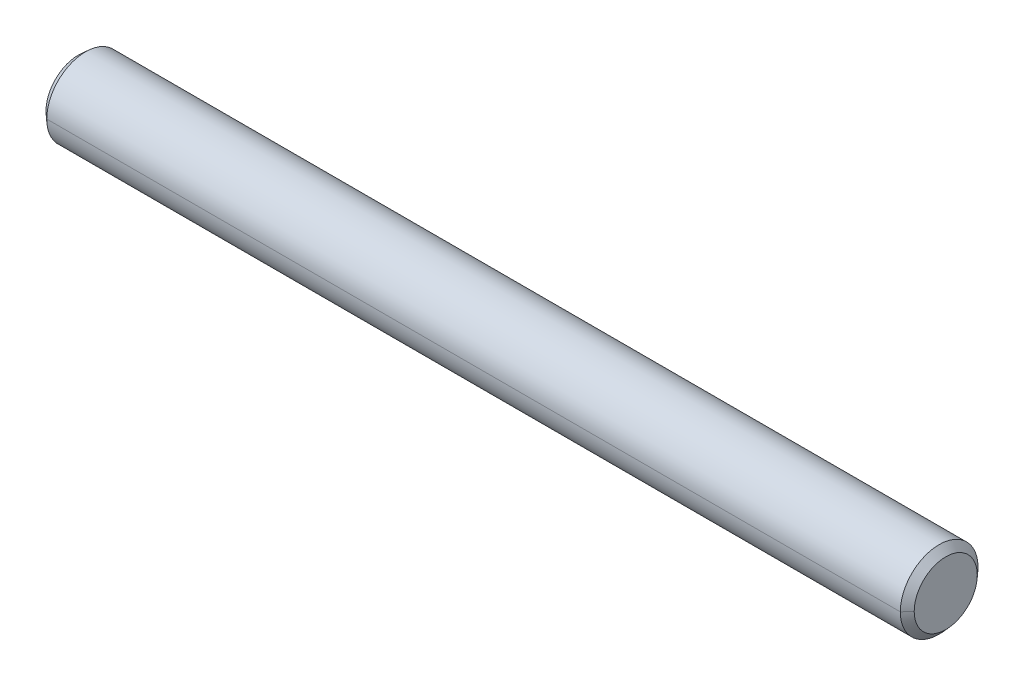
ISO-10303-21;
HEADER;
FILE_DESCRIPTION(('STEP AP214'),'2;1');
FILE_NAME('part.step','',(''),(''),'','','');
FILE_SCHEMA(('AUTOMOTIVE_DESIGN { 1 0 10303 214 1 1 1 1 }'));
ENDSEC;
DATA;
#1=APPLICATION_CONTEXT('core data for automotive mechanical design processes');
#2=APPLICATION_PROTOCOL_DEFINITION('international standard','automotive_design',2000,#1);
#3=PRODUCT_CONTEXT('',#1,'mechanical');
#4=PRODUCT('Part','Part','',(#3));
#5=PRODUCT_RELATED_PRODUCT_CATEGORY('part','',(#4));
#6=PRODUCT_DEFINITION_FORMATION('','',#4);
#7=PRODUCT_DEFINITION_CONTEXT('part definition',#1,'design');
#8=PRODUCT_DEFINITION('design','',#6,#7);
#9=PRODUCT_DEFINITION_SHAPE('','',#8);
#10=(LENGTH_UNIT() NAMED_UNIT(*) SI_UNIT(.MILLI.,.METRE.));
#11=(NAMED_UNIT(*) PLANE_ANGLE_UNIT() SI_UNIT($,.RADIAN.));
#12=(NAMED_UNIT(*) SI_UNIT($,.STERADIAN.) SOLID_ANGLE_UNIT());
#13=UNCERTAINTY_MEASURE_WITH_UNIT(LENGTH_MEASURE(1.E-05),#10,'distance_accuracy_value','');
#14=(GEOMETRIC_REPRESENTATION_CONTEXT(3) GLOBAL_UNCERTAINTY_ASSIGNED_CONTEXT((#13)) GLOBAL_UNIT_ASSIGNED_CONTEXT((#10,
#11,#12)) REPRESENTATION_CONTEXT('',''));
#15=CARTESIAN_POINT('',(0.,0.,0.));
#16=DIRECTION('',(0.,0.,1.));
#17=DIRECTION('',(1.,0.,0.));
#18=AXIS2_PLACEMENT_3D('',#15,#16,#17);
#19=CARTESIAN_POINT('',(16.75,0.,0.));
#20=DIRECTION('',(-1.,0.,0.));
#21=DIRECTION('',(0.,0.,1.));
#22=AXIS2_PLACEMENT_3D('',#19,#20,#21);
#23=CONICAL_SURFACE('',#22,1.21790442123338,0.837758040957279);
#24=CARTESIAN_POINT('',(16.75,0.,0.));
#25=DIRECTION('',(1.,0.,0.));
#26=DIRECTION('',(0.,0.,-1.));
#27=AXIS2_PLACEMENT_3D('',#24,#25,#26);
#28=CIRCLE('',#27,1.21790442123338);
#29=CARTESIAN_POINT('',(16.75,0.,-1.21790442123338));
#30=VERTEX_POINT('',#29);
#31=CARTESIAN_POINT('',(16.75,0.,1.21790442123338));
#32=VERTEX_POINT('',#31);
#33=EDGE_CURVE('E41',#30,#32,#28,.T.);
#34=ORIENTED_EDGE('',*,*,#33,.F.);
#35=DIRECTION('',(-0.669130606358858,0.,-0.743144825477394));
#36=VECTOR('',#35,1.);
#37=CARTESIAN_POINT('',(16.75,0.,-1.21790442123338));
#38=LINE('',#37,#36);
#39=CARTESIAN_POINT('',(16.496,0.,-1.5));
#40=VERTEX_POINT('',#39);
#41=EDGE_CURVE('E11',#30,#40,#38,.T.);
#42=ORIENTED_EDGE('',*,*,#41,.T.);
#43=CARTESIAN_POINT('',(16.496,0.,0.));
#44=DIRECTION('',(-1.,0.,0.));
#45=DIRECTION('',(0.,0.,-1.));
#46=AXIS2_PLACEMENT_3D('',#43,#44,#45);
#47=CIRCLE('',#46,1.5);
#48=CARTESIAN_POINT('',(16.496,0.,1.5));
#49=VERTEX_POINT('',#48);
#50=EDGE_CURVE('E86',#49,#40,#47,.T.);
#51=ORIENTED_EDGE('',*,*,#50,.F.);
#52=DIRECTION('',(-0.669130606358858,0.,0.743144825477394));
#53=VECTOR('',#52,1.);
#54=CARTESIAN_POINT('',(16.75,0.,1.21790442123338));
#55=LINE('',#54,#53);
#56=EDGE_CURVE('E84',#32,#49,#55,.T.);
#57=ORIENTED_EDGE('',*,*,#56,.F.);
#58=EDGE_LOOP('',(#34,#42,#51,#57));
#59=FACE_BOUND('',#58,.T.);
#60=ADVANCED_FACE('F16',(#59),#23,.T.);
#61=CARTESIAN_POINT('',(-16.4679044212334,0.,0.));
#62=DIRECTION('',(1.,0.,0.));
#63=DIRECTION('',(0.,0.,-1.));
#64=AXIS2_PLACEMENT_3D('',#61,#62,#63);
#65=CONICAL_SURFACE('',#64,1.5,0.733038285837623);
#66=CARTESIAN_POINT('',(-16.75,0.,0.));
#67=DIRECTION('',(-1.,0.,0.));
#68=DIRECTION('',(0.,0.,-1.));
#69=AXIS2_PLACEMENT_3D('',#66,#67,#68);
#70=CIRCLE('',#69,1.246);
#71=CARTESIAN_POINT('',(-16.75,0.,1.246));
#72=VERTEX_POINT('',#71);
#73=CARTESIAN_POINT('',(-16.75,0.,-1.246));
#74=VERTEX_POINT('',#73);
#75=EDGE_CURVE('E78',#72,#74,#70,.T.);
#76=ORIENTED_EDGE('',*,*,#75,.F.);
#77=DIRECTION('',(0.743144825477391,0.,0.669130606358863));
#78=VECTOR('',#77,1.);
#79=CARTESIAN_POINT('',(-16.4679044212334,0.,1.5));
#80=LINE('',#79,#78);
#81=CARTESIAN_POINT('',(-16.4679044212334,0.,1.5));
#82=VERTEX_POINT('',#81);
#83=EDGE_CURVE('E27',#72,#82,#80,.T.);
#84=ORIENTED_EDGE('',*,*,#83,.T.);
#85=CARTESIAN_POINT('',(-16.4679044212334,0.,0.));
#86=DIRECTION('',(1.,0.,0.));
#87=DIRECTION('',(0.,0.,-1.));
#88=AXIS2_PLACEMENT_3D('',#85,#86,#87);
#89=CIRCLE('',#88,1.5);
#90=CARTESIAN_POINT('',(-16.4679044212334,0.,-1.5));
#91=VERTEX_POINT('',#90);
#92=EDGE_CURVE('E117',#91,#82,#89,.T.);
#93=ORIENTED_EDGE('',*,*,#92,.F.);
#94=DIRECTION('',(0.743144825477391,0.,-0.669130606358863));
#95=VECTOR('',#94,1.);
#96=CARTESIAN_POINT('',(-16.4679044212334,0.,-1.5));
#97=LINE('',#96,#95);
#98=EDGE_CURVE('E91',#74,#91,#97,.T.);
#99=ORIENTED_EDGE('',*,*,#98,.F.);
#100=EDGE_LOOP('',(#76,#84,#93,#99));
#101=FACE_BOUND('',#100,.T.);
#102=ADVANCED_FACE('F18',(#101),#65,.T.);
#103=CARTESIAN_POINT('',(16.75,0.,0.));
#104=DIRECTION('',(-1.,0.,0.));
#105=DIRECTION('',(0.,0.,1.));
#106=AXIS2_PLACEMENT_3D('',#103,#104,#105);
#107=CYLINDRICAL_SURFACE('',#106,1.5);
#108=ORIENTED_EDGE('',*,*,#50,.T.);
#109=DIRECTION('',(-1.,0.,0.));
#110=VECTOR('',#109,1.);
#111=CARTESIAN_POINT('',(16.75,0.,-1.5));
#112=LINE('',#111,#110);
#113=EDGE_CURVE('E121',#40,#91,#112,.T.);
#114=ORIENTED_EDGE('',*,*,#113,.T.);
#115=ORIENTED_EDGE('',*,*,#92,.T.);
#116=DIRECTION('',(-1.,0.,0.));
#117=VECTOR('',#116,1.);
#118=CARTESIAN_POINT('',(16.75,0.,1.5));
#119=LINE('',#118,#117);
#120=EDGE_CURVE('E69',#49,#82,#119,.T.);
#121=ORIENTED_EDGE('',*,*,#120,.F.);
#122=EDGE_LOOP('',(#108,#114,#115,#121));
#123=FACE_BOUND('',#122,.T.);
#124=ADVANCED_FACE('F151',(#123),#107,.T.);
#125=CARTESIAN_POINT('',(16.75,0.,0.));
#126=DIRECTION('',(-1.,0.,0.));
#127=DIRECTION('',(0.,0.,1.));
#128=AXIS2_PLACEMENT_3D('',#125,#126,#127);
#129=CYLINDRICAL_SURFACE('',#128,1.5);
#130=ORIENTED_EDGE('',*,*,#113,.F.);
#131=CARTESIAN_POINT('',(16.496,0.,0.));
#132=DIRECTION('',(-1.,0.,0.));
#133=DIRECTION('',(0.,0.,-1.));
#134=AXIS2_PLACEMENT_3D('',#131,#132,#133);
#135=CIRCLE('',#134,1.5);
#136=EDGE_CURVE('E115',#40,#49,#135,.T.);
#137=ORIENTED_EDGE('',*,*,#136,.T.);
#138=ORIENTED_EDGE('',*,*,#120,.T.);
#139=CARTESIAN_POINT('',(-16.4679044212334,0.,0.));
#140=DIRECTION('',(1.,0.,0.));
#141=DIRECTION('',(0.,0.,-1.));
#142=AXIS2_PLACEMENT_3D('',#139,#140,#141);
#143=CIRCLE('',#142,1.5);
#144=EDGE_CURVE('E20',#82,#91,#143,.T.);
#145=ORIENTED_EDGE('',*,*,#144,.T.);
#146=EDGE_LOOP('',(#130,#137,#138,#145));
#147=FACE_BOUND('',#146,.T.);
#148=ADVANCED_FACE('F146',(#147),#129,.T.);
#149=CARTESIAN_POINT('',(16.75,0.,0.));
#150=DIRECTION('',(1.,0.,0.));
#151=DIRECTION('',(0.,1.,0.));
#152=AXIS2_PLACEMENT_3D('',#149,#150,#151);
#153=PLANE('',#152);
#154=CARTESIAN_POINT('',(16.75,0.,0.));
#155=DIRECTION('',(1.,0.,0.));
#156=DIRECTION('',(0.,0.,-1.));
#157=AXIS2_PLACEMENT_3D('',#154,#155,#156);
#158=CIRCLE('',#157,1.21790442123338);
#159=EDGE_CURVE('E96',#32,#30,#158,.T.);
#160=ORIENTED_EDGE('',*,*,#159,.T.);
#161=ORIENTED_EDGE('',*,*,#33,.T.);
#162=EDGE_LOOP('',(#160,#161));
#163=FACE_BOUND('',#162,.T.);
#164=ADVANCED_FACE('F95',(#163),#153,.T.);
#165=CARTESIAN_POINT('',(-16.75,0.,0.));
#166=DIRECTION('',(1.,0.,0.));
#167=DIRECTION('',(0.,1.,0.));
#168=AXIS2_PLACEMENT_3D('',#165,#166,#167);
#169=PLANE('',#168);
#170=CARTESIAN_POINT('',(-16.75,0.,0.));
#171=DIRECTION('',(-1.,0.,0.));
#172=DIRECTION('',(0.,0.,-1.));
#173=AXIS2_PLACEMENT_3D('',#170,#171,#172);
#174=CIRCLE('',#173,1.246);
#175=EDGE_CURVE('E98',#74,#72,#174,.T.);
#176=ORIENTED_EDGE('',*,*,#175,.T.);
#177=ORIENTED_EDGE('',*,*,#75,.T.);
#178=EDGE_LOOP('',(#176,#177));
#179=FACE_BOUND('',#178,.T.);
#180=ADVANCED_FACE('F183',(#179),#169,.F.);
#181=CARTESIAN_POINT('',(-16.4679044212334,0.,0.));
#182=DIRECTION('',(1.,0.,0.));
#183=DIRECTION('',(0.,0.,-1.));
#184=AXIS2_PLACEMENT_3D('',#181,#182,#183);
#185=CONICAL_SURFACE('',#184,1.5,0.733038285837623);
#186=ORIENTED_EDGE('',*,*,#83,.F.);
#187=ORIENTED_EDGE('',*,*,#175,.F.);
#188=ORIENTED_EDGE('',*,*,#98,.T.);
#189=ORIENTED_EDGE('',*,*,#144,.F.);
#190=EDGE_LOOP('',(#186,#187,#188,#189));
#191=FACE_BOUND('',#190,.T.);
#192=ADVANCED_FACE('F178',(#191),#185,.T.);
#193=CARTESIAN_POINT('',(16.75,0.,0.));
#194=DIRECTION('',(-1.,0.,0.));
#195=DIRECTION('',(0.,0.,1.));
#196=AXIS2_PLACEMENT_3D('',#193,#194,#195);
#197=CONICAL_SURFACE('',#196,1.21790442123338,0.837758040957279);
#198=ORIENTED_EDGE('',*,*,#41,.F.);
#199=ORIENTED_EDGE('',*,*,#159,.F.);
#200=ORIENTED_EDGE('',*,*,#56,.T.);
#201=ORIENTED_EDGE('',*,*,#136,.F.);
#202=EDGE_LOOP('',(#198,#199,#200,#201));
#203=FACE_BOUND('',#202,.T.);
#204=ADVANCED_FACE('F100',(#203),#197,.T.);
#205=CLOSED_SHELL('',(#60,#102,#124,#148,#164,#180,#192,#204));
#206=MANIFOLD_SOLID_BREP('B1',#205);
#207=ADVANCED_BREP_SHAPE_REPRESENTATION('',(#18,#206),#14);
#208=SHAPE_DEFINITION_REPRESENTATION(#9,#207);
ENDSEC;
END-ISO-10303-21;
